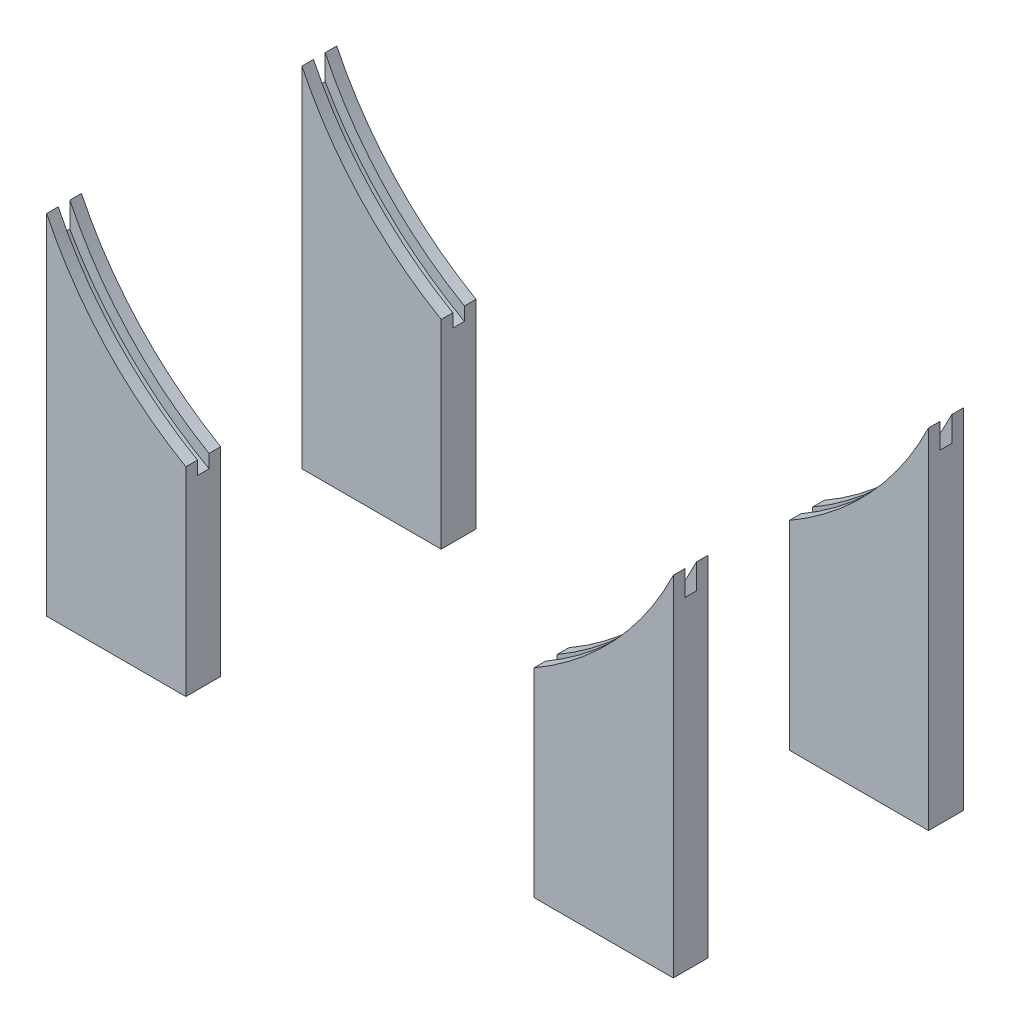
ISO-10303-21;
HEADER;
FILE_DESCRIPTION(('STEP AP214'),'2;1');
FILE_NAME('part.step','',(''),(''),'','','');
FILE_SCHEMA(('AUTOMOTIVE_DESIGN { 1 0 10303 214 1 1 1 1 }'));
ENDSEC;
DATA;
#1=APPLICATION_CONTEXT('core data for automotive mechanical design processes');
#2=APPLICATION_PROTOCOL_DEFINITION('international standard','automotive_design',2000,#1);
#3=PRODUCT_CONTEXT('',#1,'mechanical');
#4=PRODUCT('Part','Part','',(#3));
#5=PRODUCT_RELATED_PRODUCT_CATEGORY('part','',(#4));
#6=PRODUCT_DEFINITION_FORMATION('','',#4);
#7=PRODUCT_DEFINITION_CONTEXT('part definition',#1,'design');
#8=PRODUCT_DEFINITION('design','',#6,#7);
#9=PRODUCT_DEFINITION_SHAPE('','',#8);
#10=(LENGTH_UNIT() NAMED_UNIT(*) SI_UNIT(.MILLI.,.METRE.));
#11=(NAMED_UNIT(*) PLANE_ANGLE_UNIT() SI_UNIT($,.RADIAN.));
#12=(NAMED_UNIT(*) SI_UNIT($,.STERADIAN.) SOLID_ANGLE_UNIT());
#13=UNCERTAINTY_MEASURE_WITH_UNIT(LENGTH_MEASURE(1.E-05),#10,'distance_accuracy_value','');
#14=(GEOMETRIC_REPRESENTATION_CONTEXT(3) GLOBAL_UNCERTAINTY_ASSIGNED_CONTEXT((#13)) GLOBAL_UNIT_ASSIGNED_CONTEXT((#10,
#11,#12)) REPRESENTATION_CONTEXT('',''));
#15=CARTESIAN_POINT('',(0.,0.,0.));
#16=DIRECTION('',(0.,0.,1.));
#17=DIRECTION('',(1.,0.,0.));
#18=AXIS2_PLACEMENT_3D('',#15,#16,#17);
#19=CARTESIAN_POINT('',(0.,0.,110.));
#20=DIRECTION('',(0.,0.,1.));
#21=DIRECTION('',(1.,0.,0.));
#22=AXIS2_PLACEMENT_3D('',#19,#20,#21);
#23=CYLINDRICAL_SURFACE('',#22,155.);
#24=CARTESIAN_POINT('',(0.,0.,115.));
#25=DIRECTION('',(0.,0.,1.));
#26=DIRECTION('',(-1.,0.,0.));
#27=AXIS2_PLACEMENT_3D('',#24,#25,#26);
#28=CIRCLE('',#27,155.);
#29=CARTESIAN_POINT('',(-135.,-76.157731058639,115.));
#30=VERTEX_POINT('',#29);
#31=CARTESIAN_POINT('',(-75.,-135.646599662505,115.));
#32=VERTEX_POINT('',#31);
#33=EDGE_CURVE('E157',#30,#32,#28,.T.);
#34=ORIENTED_EDGE('',*,*,#33,.T.);
#35=DIRECTION('',(0.,0.,1.));
#36=VECTOR('',#35,1.);
#37=CARTESIAN_POINT('',(-75.,-135.646599662505,110.));
#38=LINE('',#37,#36);
#39=CARTESIAN_POINT('',(-74.9999999999997,-135.646599662506,110.));
#40=VERTEX_POINT('',#39);
#41=EDGE_CURVE('E12',#40,#32,#38,.T.);
#42=ORIENTED_EDGE('',*,*,#41,.F.);
#43=CARTESIAN_POINT('',(0.,0.,110.));
#44=DIRECTION('',(0.,0.,1.));
#45=DIRECTION('',(-1.,0.,0.));
#46=AXIS2_PLACEMENT_3D('',#43,#44,#45);
#47=CIRCLE('',#46,155.);
#48=CARTESIAN_POINT('',(-135.,-76.1577310586391,110.));
#49=VERTEX_POINT('',#48);
#50=EDGE_CURVE('E158',#49,#40,#47,.T.);
#51=ORIENTED_EDGE('',*,*,#50,.F.);
#52=DIRECTION('',(0.,0.,1.));
#53=VECTOR('',#52,1.);
#54=CARTESIAN_POINT('',(-135.,-76.1577310586391,110.));
#55=LINE('',#54,#53);
#56=EDGE_CURVE('E160',#49,#30,#55,.T.);
#57=ORIENTED_EDGE('',*,*,#56,.T.);
#58=EDGE_LOOP('',(#34,#42,#51,#57));
#59=FACE_BOUND('',#58,.T.);
#60=ADVANCED_FACE('F46',(#59),#23,.F.);
#61=CARTESIAN_POINT('',(-75.,-135.646599662505,110.));
#62=DIRECTION('',(-1.,0.,0.));
#63=DIRECTION('',(0.,1.,0.));
#64=AXIS2_PLACEMENT_3D('',#61,#62,#63);
#65=PLANE('',#64);
#66=ORIENTED_EDGE('',*,*,#41,.T.);
#67=DIRECTION('',(0.,-1.,0.));
#68=VECTOR('',#67,1.);
#69=CARTESIAN_POINT('',(-74.9999999999996,-129.903810567666,115.));
#70=LINE('',#69,#68);
#71=CARTESIAN_POINT('',(-74.9999999999996,-129.903810567666,115.));
#72=VERTEX_POINT('',#71);
#73=EDGE_CURVE('E130',#72,#32,#70,.T.);
#74=ORIENTED_EDGE('',*,*,#73,.F.);
#75=DIRECTION('',(0.,0.,-1.));
#76=VECTOR('',#75,1.);
#77=CARTESIAN_POINT('',(-74.9999999999996,-129.903810567666,120.));
#78=LINE('',#77,#76);
#79=CARTESIAN_POINT('',(-74.9999999999996,-129.903810567666,120.));
#80=VERTEX_POINT('',#79);
#81=EDGE_CURVE('E111',#80,#72,#78,.T.);
#82=ORIENTED_EDGE('',*,*,#81,.F.);
#83=DIRECTION('',(0.,-1.,0.));
#84=VECTOR('',#83,1.);
#85=CARTESIAN_POINT('',(-74.9999999999996,-129.903810567666,120.));
#86=LINE('',#85,#84);
#87=CARTESIAN_POINT('',(-75.,-215.646599662505,120.));
#88=VERTEX_POINT('',#87);
#89=EDGE_CURVE('E118',#80,#88,#86,.T.);
#90=ORIENTED_EDGE('',*,*,#89,.T.);
#91=DIRECTION('',(0.,0.,1.));
#92=VECTOR('',#91,1.);
#93=CARTESIAN_POINT('',(-75.,-215.646599662505,110.));
#94=LINE('',#93,#92);
#95=CARTESIAN_POINT('',(-75.,-215.646599662505,105.));
#96=VERTEX_POINT('',#95);
#97=EDGE_CURVE('E54',#96,#88,#94,.T.);
#98=ORIENTED_EDGE('',*,*,#97,.F.);
#99=DIRECTION('',(0.,-1.,0.));
#100=VECTOR('',#99,1.);
#101=CARTESIAN_POINT('',(-74.9999999999996,-129.903810567666,105.));
#102=LINE('',#101,#100);
#103=CARTESIAN_POINT('',(-74.9999999999996,-129.903810567666,105.));
#104=VERTEX_POINT('',#103);
#105=EDGE_CURVE('E137',#104,#96,#102,.T.);
#106=ORIENTED_EDGE('',*,*,#105,.F.);
#107=DIRECTION('',(0.,0.,1.));
#108=VECTOR('',#107,1.);
#109=CARTESIAN_POINT('',(-74.9999999999996,-129.903810567666,105.));
#110=LINE('',#109,#108);
#111=CARTESIAN_POINT('',(-74.9999999999996,-129.903810567666,110.));
#112=VERTEX_POINT('',#111);
#113=EDGE_CURVE('E148',#104,#112,#110,.T.);
#114=ORIENTED_EDGE('',*,*,#113,.T.);
#115=DIRECTION('',(0.,-1.,0.));
#116=VECTOR('',#115,1.);
#117=CARTESIAN_POINT('',(-74.9999999999996,-129.903810567666,110.));
#118=LINE('',#117,#116);
#119=EDGE_CURVE('E131',#112,#40,#118,.T.);
#120=ORIENTED_EDGE('',*,*,#119,.T.);
#121=EDGE_LOOP('',(#66,#74,#82,#90,#98,#106,#114,#120));
#122=FACE_BOUND('',#121,.T.);
#123=ADVANCED_FACE('F129',(#122),#65,.F.);
#124=CARTESIAN_POINT('',(-75.,-215.646599662505,110.));
#125=DIRECTION('',(0.,1.,0.));
#126=DIRECTION('',(0.,0.,-1.));
#127=AXIS2_PLACEMENT_3D('',#124,#125,#126);
#128=PLANE('',#127);
#129=ORIENTED_EDGE('',*,*,#97,.T.);
#130=DIRECTION('',(-1.,0.,0.));
#131=VECTOR('',#130,1.);
#132=CARTESIAN_POINT('',(-75.,-215.646599662505,120.));
#133=LINE('',#132,#131);
#134=CARTESIAN_POINT('',(-135.,-215.646599662505,120.));
#135=VERTEX_POINT('',#134);
#136=EDGE_CURVE('E123',#88,#135,#133,.T.);
#137=ORIENTED_EDGE('',*,*,#136,.T.);
#138=DIRECTION('',(0.,0.,1.));
#139=VECTOR('',#138,1.);
#140=CARTESIAN_POINT('',(-135.,-215.646599662505,110.));
#141=LINE('',#140,#139);
#142=CARTESIAN_POINT('',(-135.,-215.646599662505,105.));
#143=VERTEX_POINT('',#142);
#144=EDGE_CURVE('E165',#143,#135,#141,.T.);
#145=ORIENTED_EDGE('',*,*,#144,.F.);
#146=DIRECTION('',(-1.,0.,0.));
#147=VECTOR('',#146,1.);
#148=CARTESIAN_POINT('',(-75.,-215.646599662505,105.));
#149=LINE('',#148,#147);
#150=EDGE_CURVE('E140',#96,#143,#149,.T.);
#151=ORIENTED_EDGE('',*,*,#150,.F.);
#152=EDGE_LOOP('',(#129,#137,#145,#151));
#153=FACE_BOUND('',#152,.T.);
#154=ADVANCED_FACE('F168',(#153),#128,.F.);
#155=CARTESIAN_POINT('',(-135.,-215.646599662505,110.));
#156=DIRECTION('',(1.,0.,0.));
#157=DIRECTION('',(0.,-1.,0.));
#158=AXIS2_PLACEMENT_3D('',#155,#156,#157);
#159=PLANE('',#158);
#160=ORIENTED_EDGE('',*,*,#144,.T.);
#161=DIRECTION('',(0.,1.,0.));
#162=VECTOR('',#161,1.);
#163=CARTESIAN_POINT('',(-135.,-215.646599662505,120.));
#164=LINE('',#163,#162);
#165=CARTESIAN_POINT('',(-135.,-65.38348415311,120.));
#166=VERTEX_POINT('',#165);
#167=EDGE_CURVE('E117',#135,#166,#164,.T.);
#168=ORIENTED_EDGE('',*,*,#167,.T.);
#169=DIRECTION('',(0.,0.,-1.));
#170=VECTOR('',#169,1.);
#171=CARTESIAN_POINT('',(-135.,-65.38348415311,120.));
#172=LINE('',#171,#170);
#173=CARTESIAN_POINT('',(-135.,-65.38348415311,115.));
#174=VERTEX_POINT('',#173);
#175=EDGE_CURVE('E114',#166,#174,#172,.T.);
#176=ORIENTED_EDGE('',*,*,#175,.T.);
#177=DIRECTION('',(0.,1.,0.));
#178=VECTOR('',#177,1.);
#179=CARTESIAN_POINT('',(-135.,-215.646599662505,115.));
#180=LINE('',#179,#178);
#181=EDGE_CURVE('E127',#30,#174,#180,.T.);
#182=ORIENTED_EDGE('',*,*,#181,.F.);
#183=ORIENTED_EDGE('',*,*,#56,.F.);
#184=DIRECTION('',(0.,1.,0.));
#185=VECTOR('',#184,1.);
#186=CARTESIAN_POINT('',(-135.,-215.646599662505,110.));
#187=LINE('',#186,#185);
#188=CARTESIAN_POINT('',(-135.,-65.38348415311,110.));
#189=VERTEX_POINT('',#188);
#190=EDGE_CURVE('E60',#49,#189,#187,.T.);
#191=ORIENTED_EDGE('',*,*,#190,.T.);
#192=DIRECTION('',(0.,0.,1.));
#193=VECTOR('',#192,1.);
#194=CARTESIAN_POINT('',(-135.,-65.38348415311,105.));
#195=LINE('',#194,#193);
#196=CARTESIAN_POINT('',(-135.,-65.38348415311,105.));
#197=VERTEX_POINT('',#196);
#198=EDGE_CURVE('E154',#197,#189,#195,.T.);
#199=ORIENTED_EDGE('',*,*,#198,.F.);
#200=DIRECTION('',(0.,1.,0.));
#201=VECTOR('',#200,1.);
#202=CARTESIAN_POINT('',(-135.,-215.646599662505,105.));
#203=LINE('',#202,#201);
#204=EDGE_CURVE('E144',#143,#197,#203,.T.);
#205=ORIENTED_EDGE('',*,*,#204,.F.);
#206=EDGE_LOOP('',(#160,#168,#176,#182,#183,#191,#199,#205));
#207=FACE_BOUND('',#206,.T.);
#208=ADVANCED_FACE('F192',(#207),#159,.F.);
#209=CARTESIAN_POINT('',(2.67841304690819E-11,2.49383846906426E-11,110.));
#210=DIRECTION('',(0.,0.,1.));
#211=DIRECTION('',(1.,0.,0.));
#212=AXIS2_PLACEMENT_3D('',#209,#210,#211);
#213=PLANE('',#212);
#214=ORIENTED_EDGE('',*,*,#190,.F.);
#215=ORIENTED_EDGE('',*,*,#50,.T.);
#216=ORIENTED_EDGE('',*,*,#119,.F.);
#217=CARTESIAN_POINT('',(2.67841304690819E-11,2.49383846906426E-11,110.));
#218=DIRECTION('',(0.,0.,1.));
#219=DIRECTION('',(1.,0.,0.));
#220=AXIS2_PLACEMENT_3D('',#217,#218,#219);
#221=CIRCLE('',#220,150.000000000035);
#222=EDGE_CURVE('E141',#189,#112,#221,.T.);
#223=ORIENTED_EDGE('',*,*,#222,.F.);
#224=EDGE_LOOP('',(#214,#215,#216,#223));
#225=FACE_BOUND('',#224,.T.);
#226=ADVANCED_FACE('F178',(#225),#213,.T.);
#227=CARTESIAN_POINT('',(2.67841304690819E-11,2.49383846906426E-11,105.));
#228=DIRECTION('',(0.,0.,1.));
#229=DIRECTION('',(1.,0.,0.));
#230=AXIS2_PLACEMENT_3D('',#227,#228,#229);
#231=CYLINDRICAL_SURFACE('',#230,150.000000000035);
#232=ORIENTED_EDGE('',*,*,#222,.T.);
#233=ORIENTED_EDGE('',*,*,#113,.F.);
#234=CARTESIAN_POINT('',(2.67841304690819E-11,2.49383846906426E-11,105.));
#235=DIRECTION('',(0.,0.,1.));
#236=DIRECTION('',(1.,0.,0.));
#237=AXIS2_PLACEMENT_3D('',#234,#235,#236);
#238=CIRCLE('',#237,150.000000000035);
#239=EDGE_CURVE('E147',#197,#104,#238,.T.);
#240=ORIENTED_EDGE('',*,*,#239,.F.);
#241=ORIENTED_EDGE('',*,*,#198,.T.);
#242=EDGE_LOOP('',(#232,#233,#240,#241));
#243=FACE_BOUND('',#242,.T.);
#244=ADVANCED_FACE('F176',(#243),#231,.F.);
#245=CARTESIAN_POINT('',(2.67841304690819E-11,2.49383846906426E-11,105.));
#246=DIRECTION('',(0.,0.,1.));
#247=DIRECTION('',(1.,0.,0.));
#248=AXIS2_PLACEMENT_3D('',#245,#246,#247);
#249=PLANE('',#248);
#250=ORIENTED_EDGE('',*,*,#105,.T.);
#251=ORIENTED_EDGE('',*,*,#150,.T.);
#252=ORIENTED_EDGE('',*,*,#204,.T.);
#253=ORIENTED_EDGE('',*,*,#239,.T.);
#254=EDGE_LOOP('',(#250,#251,#252,#253));
#255=FACE_BOUND('',#254,.T.);
#256=ADVANCED_FACE('F173',(#255),#249,.F.);
#257=CARTESIAN_POINT('',(2.67841304690819E-11,2.49383846906426E-11,115.));
#258=DIRECTION('',(0.,0.,-1.));
#259=DIRECTION('',(1.,0.,0.));
#260=AXIS2_PLACEMENT_3D('',#257,#258,#259);
#261=PLANE('',#260);
#262=ORIENTED_EDGE('',*,*,#33,.F.);
#263=ORIENTED_EDGE('',*,*,#181,.T.);
#264=CARTESIAN_POINT('',(2.67841304690819E-11,2.49383846906426E-11,115.));
#265=DIRECTION('',(0.,0.,1.));
#266=DIRECTION('',(1.,0.,0.));
#267=AXIS2_PLACEMENT_3D('',#264,#265,#266);
#268=CIRCLE('',#267,150.000000000035);
#269=EDGE_CURVE('E186',#174,#72,#268,.T.);
#270=ORIENTED_EDGE('',*,*,#269,.T.);
#271=ORIENTED_EDGE('',*,*,#73,.T.);
#272=EDGE_LOOP('',(#262,#263,#270,#271));
#273=FACE_BOUND('',#272,.T.);
#274=ADVANCED_FACE('F185',(#273),#261,.T.);
#275=CARTESIAN_POINT('',(2.67841304690819E-11,2.49383846906426E-11,120.));
#276=DIRECTION('',(0.,0.,-1.));
#277=DIRECTION('',(-1.,0.,0.));
#278=AXIS2_PLACEMENT_3D('',#275,#276,#277);
#279=CYLINDRICAL_SURFACE('',#278,150.000000000035);
#280=ORIENTED_EDGE('',*,*,#269,.F.);
#281=ORIENTED_EDGE('',*,*,#175,.F.);
#282=CARTESIAN_POINT('',(2.67841304690819E-11,2.49383846906426E-11,120.));
#283=DIRECTION('',(0.,0.,1.));
#284=DIRECTION('',(1.,0.,0.));
#285=AXIS2_PLACEMENT_3D('',#282,#283,#284);
#286=CIRCLE('',#285,150.000000000035);
#287=EDGE_CURVE('E107',#166,#80,#286,.T.);
#288=ORIENTED_EDGE('',*,*,#287,.T.);
#289=ORIENTED_EDGE('',*,*,#81,.T.);
#290=EDGE_LOOP('',(#280,#281,#288,#289));
#291=FACE_BOUND('',#290,.T.);
#292=ADVANCED_FACE('F109',(#291),#279,.F.);
#293=CARTESIAN_POINT('',(2.67841304690819E-11,2.49383846906426E-11,120.));
#294=DIRECTION('',(0.,0.,-1.));
#295=DIRECTION('',(1.,0.,0.));
#296=AXIS2_PLACEMENT_3D('',#293,#294,#295);
#297=PLANE('',#296);
#298=ORIENTED_EDGE('',*,*,#89,.F.);
#299=ORIENTED_EDGE('',*,*,#287,.F.);
#300=ORIENTED_EDGE('',*,*,#167,.F.);
#301=ORIENTED_EDGE('',*,*,#136,.F.);
#302=EDGE_LOOP('',(#298,#299,#300,#301));
#303=FACE_BOUND('',#302,.T.);
#304=ADVANCED_FACE('F121',(#303),#297,.F.);
#305=CLOSED_SHELL('',(#60,#123,#154,#208,#226,#244,#256,#274,#292,#304));
#306=MANIFOLD_SOLID_BREP('B2',#305);
#307=CARTESIAN_POINT('',(0.,0.,110.));
#308=DIRECTION('',(0.,0.,1.));
#309=DIRECTION('',(-1.,0.,0.));
#310=AXIS2_PLACEMENT_3D('',#307,#308,#309);
#311=CYLINDRICAL_SURFACE('',#310,155.);
#312=CARTESIAN_POINT('',(0.,0.,115.));
#313=DIRECTION('',(0.,0.,-1.));
#314=DIRECTION('',(1.,0.,0.));
#315=AXIS2_PLACEMENT_3D('',#312,#313,#314);
#316=CIRCLE('',#315,155.);
#317=CARTESIAN_POINT('',(135.,-76.157731058639,115.));
#318=VERTEX_POINT('',#317);
#319=CARTESIAN_POINT('',(75.,-135.646599662505,115.));
#320=VERTEX_POINT('',#319);
#321=EDGE_CURVE('E420',#318,#320,#316,.T.);
#322=ORIENTED_EDGE('',*,*,#321,.F.);
#323=DIRECTION('',(0.,0.,1.));
#324=VECTOR('',#323,1.);
#325=CARTESIAN_POINT('',(135.,-76.1577310586391,110.));
#326=LINE('',#325,#324);
#327=CARTESIAN_POINT('',(135.,-76.1577310586391,110.));
#328=VERTEX_POINT('',#327);
#329=EDGE_CURVE('E424',#328,#318,#326,.T.);
#330=ORIENTED_EDGE('',*,*,#329,.F.);
#331=CARTESIAN_POINT('',(0.,0.,110.));
#332=DIRECTION('',(0.,0.,-1.));
#333=DIRECTION('',(1.,0.,0.));
#334=AXIS2_PLACEMENT_3D('',#331,#332,#333);
#335=CIRCLE('',#334,155.);
#336=CARTESIAN_POINT('',(74.9999999999997,-135.646599662506,110.));
#337=VERTEX_POINT('',#336);
#338=EDGE_CURVE('E421',#328,#337,#335,.T.);
#339=ORIENTED_EDGE('',*,*,#338,.T.);
#340=DIRECTION('',(0.,0.,1.));
#341=VECTOR('',#340,1.);
#342=CARTESIAN_POINT('',(75.,-135.646599662505,110.));
#343=LINE('',#342,#341);
#344=EDGE_CURVE('E44',#337,#320,#343,.T.);
#345=ORIENTED_EDGE('',*,*,#344,.T.);
#346=EDGE_LOOP('',(#322,#330,#339,#345));
#347=FACE_BOUND('',#346,.T.);
#348=ADVANCED_FACE('F302',(#347),#311,.F.);
#349=CARTESIAN_POINT('',(75.,-135.646599662505,110.));
#350=DIRECTION('',(1.,0.,0.));
#351=DIRECTION('',(0.,1.,0.));
#352=AXIS2_PLACEMENT_3D('',#349,#350,#351);
#353=PLANE('',#352);
#354=ORIENTED_EDGE('',*,*,#344,.F.);
#355=DIRECTION('',(0.,-1.,0.));
#356=VECTOR('',#355,1.);
#357=CARTESIAN_POINT('',(74.9999999999996,-129.903810567666,110.));
#358=LINE('',#357,#356);
#359=CARTESIAN_POINT('',(74.9999999999996,-129.903810567666,110.));
#360=VERTEX_POINT('',#359);
#361=EDGE_CURVE('E382',#360,#337,#358,.T.);
#362=ORIENTED_EDGE('',*,*,#361,.F.);
#363=DIRECTION('',(0.,0.,1.));
#364=VECTOR('',#363,1.);
#365=CARTESIAN_POINT('',(74.9999999999996,-129.903810567666,105.));
#366=LINE('',#365,#364);
#367=CARTESIAN_POINT('',(74.9999999999996,-129.903810567666,105.));
#368=VERTEX_POINT('',#367);
#369=EDGE_CURVE('E412',#368,#360,#366,.T.);
#370=ORIENTED_EDGE('',*,*,#369,.F.);
#371=DIRECTION('',(0.,-1.,0.));
#372=VECTOR('',#371,1.);
#373=CARTESIAN_POINT('',(74.9999999999996,-129.903810567666,105.));
#374=LINE('',#373,#372);
#375=CARTESIAN_POINT('',(75.,-215.646599662505,105.));
#376=VERTEX_POINT('',#375);
#377=EDGE_CURVE('E401',#368,#376,#374,.T.);
#378=ORIENTED_EDGE('',*,*,#377,.T.);
#379=DIRECTION('',(0.,0.,1.));
#380=VECTOR('',#379,1.);
#381=CARTESIAN_POINT('',(75.,-215.646599662505,110.));
#382=LINE('',#381,#380);
#383=CARTESIAN_POINT('',(75.,-215.646599662505,120.));
#384=VERTEX_POINT('',#383);
#385=EDGE_CURVE('E310',#376,#384,#382,.T.);
#386=ORIENTED_EDGE('',*,*,#385,.T.);
#387=DIRECTION('',(0.,-1.,0.));
#388=VECTOR('',#387,1.);
#389=CARTESIAN_POINT('',(74.9999999999996,-129.903810567666,120.));
#390=LINE('',#389,#388);
#391=CARTESIAN_POINT('',(74.9999999999996,-129.903810567666,120.));
#392=VERTEX_POINT('',#391);
#393=EDGE_CURVE('E369',#392,#384,#390,.T.);
#394=ORIENTED_EDGE('',*,*,#393,.F.);
#395=DIRECTION('',(0.,0.,-1.));
#396=VECTOR('',#395,1.);
#397=CARTESIAN_POINT('',(74.9999999999996,-129.903810567666,120.));
#398=LINE('',#397,#396);
#399=CARTESIAN_POINT('',(74.9999999999996,-129.903810567666,115.));
#400=VERTEX_POINT('',#399);
#401=EDGE_CURVE('E377',#392,#400,#398,.T.);
#402=ORIENTED_EDGE('',*,*,#401,.T.);
#403=DIRECTION('',(0.,-1.,0.));
#404=VECTOR('',#403,1.);
#405=CARTESIAN_POINT('',(74.9999999999996,-129.903810567666,115.));
#406=LINE('',#405,#404);
#407=EDGE_CURVE('E397',#400,#320,#406,.T.);
#408=ORIENTED_EDGE('',*,*,#407,.T.);
#409=EDGE_LOOP('',(#354,#362,#370,#378,#386,#394,#402,#408));
#410=FACE_BOUND('',#409,.T.);
#411=ADVANCED_FACE('F386',(#410),#353,.F.);
#412=CARTESIAN_POINT('',(75.,-215.646599662505,110.));
#413=DIRECTION('',(0.,1.,0.));
#414=DIRECTION('',(0.,0.,-1.));
#415=AXIS2_PLACEMENT_3D('',#412,#413,#414);
#416=PLANE('',#415);
#417=ORIENTED_EDGE('',*,*,#385,.F.);
#418=DIRECTION('',(1.,0.,0.));
#419=VECTOR('',#418,1.);
#420=CARTESIAN_POINT('',(75.,-215.646599662505,105.));
#421=LINE('',#420,#419);
#422=CARTESIAN_POINT('',(135.,-215.646599662505,105.));
#423=VERTEX_POINT('',#422);
#424=EDGE_CURVE('E403',#376,#423,#421,.T.);
#425=ORIENTED_EDGE('',*,*,#424,.T.);
#426=DIRECTION('',(0.,0.,1.));
#427=VECTOR('',#426,1.);
#428=CARTESIAN_POINT('',(135.,-215.646599662505,110.));
#429=LINE('',#428,#427);
#430=CARTESIAN_POINT('',(135.,-215.646599662505,120.));
#431=VERTEX_POINT('',#430);
#432=EDGE_CURVE('E428',#423,#431,#429,.T.);
#433=ORIENTED_EDGE('',*,*,#432,.T.);
#434=DIRECTION('',(1.,0.,0.));
#435=VECTOR('',#434,1.);
#436=CARTESIAN_POINT('',(75.,-215.646599662505,120.));
#437=LINE('',#436,#435);
#438=EDGE_CURVE('E395',#384,#431,#437,.T.);
#439=ORIENTED_EDGE('',*,*,#438,.F.);
#440=EDGE_LOOP('',(#417,#425,#433,#439));
#441=FACE_BOUND('',#440,.T.);
#442=ADVANCED_FACE('F432',(#441),#416,.F.);
#443=CARTESIAN_POINT('',(135.,-215.646599662505,110.));
#444=DIRECTION('',(-1.,0.,0.));
#445=DIRECTION('',(0.,-1.,0.));
#446=AXIS2_PLACEMENT_3D('',#443,#444,#445);
#447=PLANE('',#446);
#448=ORIENTED_EDGE('',*,*,#432,.F.);
#449=DIRECTION('',(0.,1.,0.));
#450=VECTOR('',#449,1.);
#451=CARTESIAN_POINT('',(135.,-215.646599662505,105.));
#452=LINE('',#451,#450);
#453=CARTESIAN_POINT('',(135.,-65.38348415311,105.));
#454=VERTEX_POINT('',#453);
#455=EDGE_CURVE('E407',#423,#454,#452,.T.);
#456=ORIENTED_EDGE('',*,*,#455,.T.);
#457=DIRECTION('',(0.,0.,1.));
#458=VECTOR('',#457,1.);
#459=CARTESIAN_POINT('',(135.,-65.38348415311,105.));
#460=LINE('',#459,#458);
#461=CARTESIAN_POINT('',(135.,-65.38348415311,110.));
#462=VERTEX_POINT('',#461);
#463=EDGE_CURVE('E418',#454,#462,#460,.T.);
#464=ORIENTED_EDGE('',*,*,#463,.T.);
#465=DIRECTION('',(0.,1.,0.));
#466=VECTOR('',#465,1.);
#467=CARTESIAN_POINT('',(135.,-215.646599662505,110.));
#468=LINE('',#467,#466);
#469=EDGE_CURVE('E316',#328,#462,#468,.T.);
#470=ORIENTED_EDGE('',*,*,#469,.F.);
#471=ORIENTED_EDGE('',*,*,#329,.T.);
#472=DIRECTION('',(0.,1.,0.));
#473=VECTOR('',#472,1.);
#474=CARTESIAN_POINT('',(135.,-215.646599662505,115.));
#475=LINE('',#474,#473);
#476=CARTESIAN_POINT('',(135.,-65.38348415311,115.));
#477=VERTEX_POINT('',#476);
#478=EDGE_CURVE('E389',#318,#477,#475,.T.);
#479=ORIENTED_EDGE('',*,*,#478,.T.);
#480=DIRECTION('',(0.,0.,-1.));
#481=VECTOR('',#480,1.);
#482=CARTESIAN_POINT('',(135.,-65.38348415311,120.));
#483=LINE('',#482,#481);
#484=CARTESIAN_POINT('',(135.,-65.38348415311,120.));
#485=VERTEX_POINT('',#484);
#486=EDGE_CURVE('E383',#485,#477,#483,.T.);
#487=ORIENTED_EDGE('',*,*,#486,.F.);
#488=DIRECTION('',(0.,1.,0.));
#489=VECTOR('',#488,1.);
#490=CARTESIAN_POINT('',(135.,-215.646599662505,120.));
#491=LINE('',#490,#489);
#492=EDGE_CURVE('E371',#431,#485,#491,.T.);
#493=ORIENTED_EDGE('',*,*,#492,.F.);
#494=EDGE_LOOP('',(#448,#456,#464,#470,#471,#479,#487,#493));
#495=FACE_BOUND('',#494,.T.);
#496=ADVANCED_FACE('F433',(#495),#447,.F.);
#497=CARTESIAN_POINT('',(-2.67841304690819E-11,2.49383846906426E-11,110.));
#498=DIRECTION('',(0.,0.,1.));
#499=DIRECTION('',(-1.,0.,0.));
#500=AXIS2_PLACEMENT_3D('',#497,#498,#499);
#501=PLANE('',#500);
#502=ORIENTED_EDGE('',*,*,#469,.T.);
#503=CARTESIAN_POINT('',(-2.67841304690819E-11,2.49383846906426E-11,110.));
#504=DIRECTION('',(0.,0.,-1.));
#505=DIRECTION('',(-1.,0.,0.));
#506=AXIS2_PLACEMENT_3D('',#503,#504,#505);
#507=CIRCLE('',#506,150.000000000035);
#508=EDGE_CURVE('E404',#462,#360,#507,.T.);
#509=ORIENTED_EDGE('',*,*,#508,.T.);
#510=ORIENTED_EDGE('',*,*,#361,.T.);
#511=ORIENTED_EDGE('',*,*,#338,.F.);
#512=EDGE_LOOP('',(#502,#509,#510,#511));
#513=FACE_BOUND('',#512,.T.);
#514=ADVANCED_FACE('F441',(#513),#501,.T.);
#515=CARTESIAN_POINT('',(-2.67841304690819E-11,2.49383846906426E-11,105.));
#516=DIRECTION('',(0.,0.,1.));
#517=DIRECTION('',(-1.,0.,0.));
#518=AXIS2_PLACEMENT_3D('',#515,#516,#517);
#519=CYLINDRICAL_SURFACE('',#518,150.000000000035);
#520=ORIENTED_EDGE('',*,*,#508,.F.);
#521=ORIENTED_EDGE('',*,*,#463,.F.);
#522=CARTESIAN_POINT('',(-2.67841304690819E-11,2.49383846906426E-11,105.));
#523=DIRECTION('',(0.,0.,-1.));
#524=DIRECTION('',(-1.,0.,0.));
#525=AXIS2_PLACEMENT_3D('',#522,#523,#524);
#526=CIRCLE('',#525,150.000000000035);
#527=EDGE_CURVE('E410',#454,#368,#526,.T.);
#528=ORIENTED_EDGE('',*,*,#527,.T.);
#529=ORIENTED_EDGE('',*,*,#369,.T.);
#530=EDGE_LOOP('',(#520,#521,#528,#529));
#531=FACE_BOUND('',#530,.T.);
#532=ADVANCED_FACE('F445',(#531),#519,.F.);
#533=CARTESIAN_POINT('',(-2.67841304690819E-11,2.49383846906426E-11,105.));
#534=DIRECTION('',(0.,0.,1.));
#535=DIRECTION('',(-1.,0.,0.));
#536=AXIS2_PLACEMENT_3D('',#533,#534,#535);
#537=PLANE('',#536);
#538=ORIENTED_EDGE('',*,*,#377,.F.);
#539=ORIENTED_EDGE('',*,*,#527,.F.);
#540=ORIENTED_EDGE('',*,*,#455,.F.);
#541=ORIENTED_EDGE('',*,*,#424,.F.);
#542=EDGE_LOOP('',(#538,#539,#540,#541));
#543=FACE_BOUND('',#542,.T.);
#544=ADVANCED_FACE('F448',(#543),#537,.F.);
#545=CARTESIAN_POINT('',(-2.67841304690819E-11,2.49383846906426E-11,115.));
#546=DIRECTION('',(0.,0.,-1.));
#547=DIRECTION('',(-1.,0.,0.));
#548=AXIS2_PLACEMENT_3D('',#545,#546,#547);
#549=PLANE('',#548);
#550=ORIENTED_EDGE('',*,*,#321,.T.);
#551=ORIENTED_EDGE('',*,*,#407,.F.);
#552=CARTESIAN_POINT('',(-2.67841304690819E-11,2.49383846906426E-11,115.));
#553=DIRECTION('',(0.,0.,-1.));
#554=DIRECTION('',(-1.,0.,0.));
#555=AXIS2_PLACEMENT_3D('',#552,#553,#554);
#556=CIRCLE('',#555,150.000000000035);
#557=EDGE_CURVE('E379',#477,#400,#556,.T.);
#558=ORIENTED_EDGE('',*,*,#557,.F.);
#559=ORIENTED_EDGE('',*,*,#478,.F.);
#560=EDGE_LOOP('',(#550,#551,#558,#559));
#561=FACE_BOUND('',#560,.T.);
#562=ADVANCED_FACE('F437',(#561),#549,.T.);
#563=CARTESIAN_POINT('',(-2.67841304690819E-11,2.49383846906426E-11,120.));
#564=DIRECTION('',(0.,0.,-1.));
#565=DIRECTION('',(1.,0.,0.));
#566=AXIS2_PLACEMENT_3D('',#563,#564,#565);
#567=CYLINDRICAL_SURFACE('',#566,150.000000000035);
#568=ORIENTED_EDGE('',*,*,#557,.T.);
#569=ORIENTED_EDGE('',*,*,#401,.F.);
#570=CARTESIAN_POINT('',(-2.67841304690819E-11,2.49383846906426E-11,120.));
#571=DIRECTION('',(0.,0.,-1.));
#572=DIRECTION('',(-1.,0.,0.));
#573=AXIS2_PLACEMENT_3D('',#570,#571,#572);
#574=CIRCLE('',#573,150.000000000035);
#575=EDGE_CURVE('E364',#485,#392,#574,.T.);
#576=ORIENTED_EDGE('',*,*,#575,.F.);
#577=ORIENTED_EDGE('',*,*,#486,.T.);
#578=EDGE_LOOP('',(#568,#569,#576,#577));
#579=FACE_BOUND('',#578,.T.);
#580=ADVANCED_FACE('F378',(#579),#567,.F.);
#581=CARTESIAN_POINT('',(-2.67841304690819E-11,2.49383846906426E-11,120.));
#582=DIRECTION('',(0.,0.,-1.));
#583=DIRECTION('',(-1.,0.,0.));
#584=AXIS2_PLACEMENT_3D('',#581,#582,#583);
#585=PLANE('',#584);
#586=ORIENTED_EDGE('',*,*,#393,.T.);
#587=ORIENTED_EDGE('',*,*,#438,.T.);
#588=ORIENTED_EDGE('',*,*,#492,.T.);
#589=ORIENTED_EDGE('',*,*,#575,.T.);
#590=EDGE_LOOP('',(#586,#587,#588,#589));
#591=FACE_BOUND('',#590,.T.);
#592=ADVANCED_FACE('F366',(#591),#585,.F.);
#593=CLOSED_SHELL('',(#348,#411,#442,#496,#514,#532,#544,#562,#580,#592));
#594=MANIFOLD_SOLID_BREP('B6',#593);
#595=CARTESIAN_POINT('',(0.,0.,5.));
#596=DIRECTION('',(0.,0.,-1.));
#597=DIRECTION('',(1.,0.,0.));
#598=AXIS2_PLACEMENT_3D('',#595,#596,#597);
#599=CYLINDRICAL_SURFACE('',#598,155.);
#600=CARTESIAN_POINT('',(0.,0.,0.));
#601=DIRECTION('',(0.,0.,1.));
#602=DIRECTION('',(-1.,0.,0.));
#603=AXIS2_PLACEMENT_3D('',#600,#601,#602);
#604=CIRCLE('',#603,155.);
#605=CARTESIAN_POINT('',(-135.,-76.157731058639,0.));
#606=VERTEX_POINT('',#605);
#607=CARTESIAN_POINT('',(-75.,-135.646599662505,0.));
#608=VERTEX_POINT('',#607);
#609=EDGE_CURVE('E675',#606,#608,#604,.T.);
#610=ORIENTED_EDGE('',*,*,#609,.F.);
#611=DIRECTION('',(0.,0.,-1.));
#612=VECTOR('',#611,1.);
#613=CARTESIAN_POINT('',(-135.,-76.1577310586391,5.));
#614=LINE('',#613,#612);
#615=CARTESIAN_POINT('',(-135.,-76.1577310586391,5.));
#616=VERTEX_POINT('',#615);
#617=EDGE_CURVE('E679',#616,#606,#614,.T.);
#618=ORIENTED_EDGE('',*,*,#617,.F.);
#619=CARTESIAN_POINT('',(0.,0.,5.));
#620=DIRECTION('',(0.,0.,1.));
#621=DIRECTION('',(-1.,0.,0.));
#622=AXIS2_PLACEMENT_3D('',#619,#620,#621);
#623=CIRCLE('',#622,155.);
#624=CARTESIAN_POINT('',(-74.9999999999997,-135.646599662506,5.));
#625=VERTEX_POINT('',#624);
#626=EDGE_CURVE('E676',#616,#625,#623,.T.);
#627=ORIENTED_EDGE('',*,*,#626,.T.);
#628=DIRECTION('',(0.,0.,-1.));
#629=VECTOR('',#628,1.);
#630=CARTESIAN_POINT('',(-75.,-135.646599662505,5.));
#631=LINE('',#630,#629);
#632=EDGE_CURVE('E300',#625,#608,#631,.T.);
#633=ORIENTED_EDGE('',*,*,#632,.T.);
#634=EDGE_LOOP('',(#610,#618,#627,#633));
#635=FACE_BOUND('',#634,.T.);
#636=ADVANCED_FACE('F557',(#635),#599,.F.);
#637=CARTESIAN_POINT('',(-75.,-135.646599662505,5.));
#638=DIRECTION('',(-1.,0.,0.));
#639=DIRECTION('',(0.,1.,0.));
#640=AXIS2_PLACEMENT_3D('',#637,#638,#639);
#641=PLANE('',#640);
#642=ORIENTED_EDGE('',*,*,#632,.F.);
#643=DIRECTION('',(0.,-1.,0.));
#644=VECTOR('',#643,1.);
#645=CARTESIAN_POINT('',(-74.9999999999996,-129.903810567666,5.));
#646=LINE('',#645,#644);
#647=CARTESIAN_POINT('',(-74.9999999999996,-129.903810567666,5.));
#648=VERTEX_POINT('',#647);
#649=EDGE_CURVE('E637',#648,#625,#646,.T.);
#650=ORIENTED_EDGE('',*,*,#649,.F.);
#651=DIRECTION('',(0.,0.,-1.));
#652=VECTOR('',#651,1.);
#653=CARTESIAN_POINT('',(-74.9999999999996,-129.903810567666,10.));
#654=LINE('',#653,#652);
#655=CARTESIAN_POINT('',(-74.9999999999996,-129.903810567666,10.));
#656=VERTEX_POINT('',#655);
#657=EDGE_CURVE('E667',#656,#648,#654,.T.);
#658=ORIENTED_EDGE('',*,*,#657,.F.);
#659=DIRECTION('',(0.,-1.,0.));
#660=VECTOR('',#659,1.);
#661=CARTESIAN_POINT('',(-74.9999999999996,-129.903810567666,10.));
#662=LINE('',#661,#660);
#663=CARTESIAN_POINT('',(-75.,-215.646599662505,10.));
#664=VERTEX_POINT('',#663);
#665=EDGE_CURVE('E656',#656,#664,#662,.T.);
#666=ORIENTED_EDGE('',*,*,#665,.T.);
#667=DIRECTION('',(0.,0.,-1.));
#668=VECTOR('',#667,1.);
#669=CARTESIAN_POINT('',(-75.,-215.646599662505,5.));
#670=LINE('',#669,#668);
#671=CARTESIAN_POINT('',(-75.,-215.646599662505,-5.));
#672=VERTEX_POINT('',#671);
#673=EDGE_CURVE('E565',#664,#672,#670,.T.);
#674=ORIENTED_EDGE('',*,*,#673,.T.);
#675=DIRECTION('',(0.,-1.,0.));
#676=VECTOR('',#675,1.);
#677=CARTESIAN_POINT('',(-74.9999999999996,-129.903810567666,-5.));
#678=LINE('',#677,#676);
#679=CARTESIAN_POINT('',(-74.9999999999996,-129.903810567666,-5.));
#680=VERTEX_POINT('',#679);
#681=EDGE_CURVE('E624',#680,#672,#678,.T.);
#682=ORIENTED_EDGE('',*,*,#681,.F.);
#683=DIRECTION('',(0.,0.,1.));
#684=VECTOR('',#683,1.);
#685=CARTESIAN_POINT('',(-74.9999999999996,-129.903810567666,-5.));
#686=LINE('',#685,#684);
#687=CARTESIAN_POINT('',(-74.9999999999996,-129.903810567666,0.));
#688=VERTEX_POINT('',#687);
#689=EDGE_CURVE('E632',#680,#688,#686,.T.);
#690=ORIENTED_EDGE('',*,*,#689,.T.);
#691=DIRECTION('',(0.,-1.,0.));
#692=VECTOR('',#691,1.);
#693=CARTESIAN_POINT('',(-74.9999999999996,-129.903810567666,0.));
#694=LINE('',#693,#692);
#695=EDGE_CURVE('E652',#688,#608,#694,.T.);
#696=ORIENTED_EDGE('',*,*,#695,.T.);
#697=EDGE_LOOP('',(#642,#650,#658,#666,#674,#682,#690,#696));
#698=FACE_BOUND('',#697,.T.);
#699=ADVANCED_FACE('F641',(#698),#641,.F.);
#700=CARTESIAN_POINT('',(-75.,-215.646599662505,5.));
#701=DIRECTION('',(0.,1.,0.));
#702=DIRECTION('',(0.,0.,1.));
#703=AXIS2_PLACEMENT_3D('',#700,#701,#702);
#704=PLANE('',#703);
#705=ORIENTED_EDGE('',*,*,#673,.F.);
#706=DIRECTION('',(-1.,0.,0.));
#707=VECTOR('',#706,1.);
#708=CARTESIAN_POINT('',(-75.,-215.646599662505,10.));
#709=LINE('',#708,#707);
#710=CARTESIAN_POINT('',(-135.,-215.646599662505,10.));
#711=VERTEX_POINT('',#710);
#712=EDGE_CURVE('E658',#664,#711,#709,.T.);
#713=ORIENTED_EDGE('',*,*,#712,.T.);
#714=DIRECTION('',(0.,0.,-1.));
#715=VECTOR('',#714,1.);
#716=CARTESIAN_POINT('',(-135.,-215.646599662505,5.));
#717=LINE('',#716,#715);
#718=CARTESIAN_POINT('',(-135.,-215.646599662505,-5.));
#719=VERTEX_POINT('',#718);
#720=EDGE_CURVE('E683',#711,#719,#717,.T.);
#721=ORIENTED_EDGE('',*,*,#720,.T.);
#722=DIRECTION('',(-1.,0.,0.));
#723=VECTOR('',#722,1.);
#724=CARTESIAN_POINT('',(-75.,-215.646599662505,-5.));
#725=LINE('',#724,#723);
#726=EDGE_CURVE('E650',#672,#719,#725,.T.);
#727=ORIENTED_EDGE('',*,*,#726,.F.);
#728=EDGE_LOOP('',(#705,#713,#721,#727));
#729=FACE_BOUND('',#728,.T.);
#730=ADVANCED_FACE('F687',(#729),#704,.F.);
#731=CARTESIAN_POINT('',(-135.,-215.646599662505,5.));
#732=DIRECTION('',(1.,0.,0.));
#733=DIRECTION('',(0.,-1.,0.));
#734=AXIS2_PLACEMENT_3D('',#731,#732,#733);
#735=PLANE('',#734);
#736=ORIENTED_EDGE('',*,*,#720,.F.);
#737=DIRECTION('',(0.,1.,0.));
#738=VECTOR('',#737,1.);
#739=CARTESIAN_POINT('',(-135.,-215.646599662505,10.));
#740=LINE('',#739,#738);
#741=CARTESIAN_POINT('',(-135.,-65.38348415311,10.));
#742=VERTEX_POINT('',#741);
#743=EDGE_CURVE('E662',#711,#742,#740,.T.);
#744=ORIENTED_EDGE('',*,*,#743,.T.);
#745=DIRECTION('',(0.,0.,-1.));
#746=VECTOR('',#745,1.);
#747=CARTESIAN_POINT('',(-135.,-65.38348415311,10.));
#748=LINE('',#747,#746);
#749=CARTESIAN_POINT('',(-135.,-65.38348415311,5.));
#750=VERTEX_POINT('',#749);
#751=EDGE_CURVE('E673',#742,#750,#748,.T.);
#752=ORIENTED_EDGE('',*,*,#751,.T.);
#753=DIRECTION('',(0.,1.,0.));
#754=VECTOR('',#753,1.);
#755=CARTESIAN_POINT('',(-135.,-215.646599662505,5.));
#756=LINE('',#755,#754);
#757=EDGE_CURVE('E571',#616,#750,#756,.T.);
#758=ORIENTED_EDGE('',*,*,#757,.F.);
#759=ORIENTED_EDGE('',*,*,#617,.T.);
#760=DIRECTION('',(0.,1.,0.));
#761=VECTOR('',#760,1.);
#762=CARTESIAN_POINT('',(-135.,-215.646599662505,0.));
#763=LINE('',#762,#761);
#764=CARTESIAN_POINT('',(-135.,-65.38348415311,0.));
#765=VERTEX_POINT('',#764);
#766=EDGE_CURVE('E644',#606,#765,#763,.T.);
#767=ORIENTED_EDGE('',*,*,#766,.T.);
#768=DIRECTION('',(0.,0.,1.));
#769=VECTOR('',#768,1.);
#770=CARTESIAN_POINT('',(-135.,-65.38348415311,-5.));
#771=LINE('',#770,#769);
#772=CARTESIAN_POINT('',(-135.,-65.38348415311,-5.));
#773=VERTEX_POINT('',#772);
#774=EDGE_CURVE('E638',#773,#765,#771,.T.);
#775=ORIENTED_EDGE('',*,*,#774,.F.);
#776=DIRECTION('',(0.,1.,0.));
#777=VECTOR('',#776,1.);
#778=CARTESIAN_POINT('',(-135.,-215.646599662505,-5.));
#779=LINE('',#778,#777);
#780=EDGE_CURVE('E626',#719,#773,#779,.T.);
#781=ORIENTED_EDGE('',*,*,#780,.F.);
#782=EDGE_LOOP('',(#736,#744,#752,#758,#759,#767,#775,#781));
#783=FACE_BOUND('',#782,.T.);
#784=ADVANCED_FACE('F688',(#783),#735,.F.);
#785=CARTESIAN_POINT('',(2.67841304690819E-11,2.49383846906426E-11,5.));
#786=DIRECTION('',(0.,0.,-1.));
#787=DIRECTION('',(1.,0.,0.));
#788=AXIS2_PLACEMENT_3D('',#785,#786,#787);
#789=PLANE('',#788);
#790=ORIENTED_EDGE('',*,*,#757,.T.);
#791=CARTESIAN_POINT('',(2.67841304690819E-11,2.49383846906426E-11,5.));
#792=DIRECTION('',(0.,0.,1.));
#793=DIRECTION('',(1.,0.,0.));
#794=AXIS2_PLACEMENT_3D('',#791,#792,#793);
#795=CIRCLE('',#794,150.000000000035);
#796=EDGE_CURVE('E659',#750,#648,#795,.T.);
#797=ORIENTED_EDGE('',*,*,#796,.T.);
#798=ORIENTED_EDGE('',*,*,#649,.T.);
#799=ORIENTED_EDGE('',*,*,#626,.F.);
#800=EDGE_LOOP('',(#790,#797,#798,#799));
#801=FACE_BOUND('',#800,.T.);
#802=ADVANCED_FACE('F696',(#801),#789,.T.);
#803=CARTESIAN_POINT('',(2.67841304690819E-11,2.49383846906426E-11,10.));
#804=DIRECTION('',(0.,0.,-1.));
#805=DIRECTION('',(1.,0.,0.));
#806=AXIS2_PLACEMENT_3D('',#803,#804,#805);
#807=CYLINDRICAL_SURFACE('',#806,150.000000000035);
#808=ORIENTED_EDGE('',*,*,#796,.F.);
#809=ORIENTED_EDGE('',*,*,#751,.F.);
#810=CARTESIAN_POINT('',(2.67841304690819E-11,2.49383846906426E-11,10.));
#811=DIRECTION('',(0.,0.,1.));
#812=DIRECTION('',(1.,0.,0.));
#813=AXIS2_PLACEMENT_3D('',#810,#811,#812);
#814=CIRCLE('',#813,150.000000000035);
#815=EDGE_CURVE('E665',#742,#656,#814,.T.);
#816=ORIENTED_EDGE('',*,*,#815,.T.);
#817=ORIENTED_EDGE('',*,*,#657,.T.);
#818=EDGE_LOOP('',(#808,#809,#816,#817));
#819=FACE_BOUND('',#818,.T.);
#820=ADVANCED_FACE('F700',(#819),#807,.F.);
#821=CARTESIAN_POINT('',(2.67841304690819E-11,2.49383846906426E-11,10.));
#822=DIRECTION('',(0.,0.,-1.));
#823=DIRECTION('',(1.,0.,0.));
#824=AXIS2_PLACEMENT_3D('',#821,#822,#823);
#825=PLANE('',#824);
#826=ORIENTED_EDGE('',*,*,#665,.F.);
#827=ORIENTED_EDGE('',*,*,#815,.F.);
#828=ORIENTED_EDGE('',*,*,#743,.F.);
#829=ORIENTED_EDGE('',*,*,#712,.F.);
#830=EDGE_LOOP('',(#826,#827,#828,#829));
#831=FACE_BOUND('',#830,.T.);
#832=ADVANCED_FACE('F703',(#831),#825,.F.);
#833=CARTESIAN_POINT('',(2.67841304690819E-11,2.49383846906426E-11,0.));
#834=DIRECTION('',(0.,0.,1.));
#835=DIRECTION('',(1.,0.,0.));
#836=AXIS2_PLACEMENT_3D('',#833,#834,#835);
#837=PLANE('',#836);
#838=ORIENTED_EDGE('',*,*,#609,.T.);
#839=ORIENTED_EDGE('',*,*,#695,.F.);
#840=CARTESIAN_POINT('',(2.67841304690819E-11,2.49383846906426E-11,0.));
#841=DIRECTION('',(0.,0.,1.));
#842=DIRECTION('',(1.,0.,0.));
#843=AXIS2_PLACEMENT_3D('',#840,#841,#842);
#844=CIRCLE('',#843,150.000000000035);
#845=EDGE_CURVE('E634',#765,#688,#844,.T.);
#846=ORIENTED_EDGE('',*,*,#845,.F.);
#847=ORIENTED_EDGE('',*,*,#766,.F.);
#848=EDGE_LOOP('',(#838,#839,#846,#847));
#849=FACE_BOUND('',#848,.T.);
#850=ADVANCED_FACE('F692',(#849),#837,.T.);
#851=CARTESIAN_POINT('',(2.67841304690819E-11,2.49383846906426E-11,-5.));
#852=DIRECTION('',(0.,0.,1.));
#853=DIRECTION('',(-1.,0.,0.));
#854=AXIS2_PLACEMENT_3D('',#851,#852,#853);
#855=CYLINDRICAL_SURFACE('',#854,150.000000000035);
#856=ORIENTED_EDGE('',*,*,#845,.T.);
#857=ORIENTED_EDGE('',*,*,#689,.F.);
#858=CARTESIAN_POINT('',(2.67841304690819E-11,2.49383846906426E-11,-5.));
#859=DIRECTION('',(0.,0.,1.));
#860=DIRECTION('',(1.,0.,0.));
#861=AXIS2_PLACEMENT_3D('',#858,#859,#860);
#862=CIRCLE('',#861,150.000000000035);
#863=EDGE_CURVE('E619',#773,#680,#862,.T.);
#864=ORIENTED_EDGE('',*,*,#863,.F.);
#865=ORIENTED_EDGE('',*,*,#774,.T.);
#866=EDGE_LOOP('',(#856,#857,#864,#865));
#867=FACE_BOUND('',#866,.T.);
#868=ADVANCED_FACE('F633',(#867),#855,.F.);
#869=CARTESIAN_POINT('',(2.67841304690819E-11,2.49383846906426E-11,-5.));
#870=DIRECTION('',(0.,0.,1.));
#871=DIRECTION('',(1.,0.,0.));
#872=AXIS2_PLACEMENT_3D('',#869,#870,#871);
#873=PLANE('',#872);
#874=ORIENTED_EDGE('',*,*,#681,.T.);
#875=ORIENTED_EDGE('',*,*,#726,.T.);
#876=ORIENTED_EDGE('',*,*,#780,.T.);
#877=ORIENTED_EDGE('',*,*,#863,.T.);
#878=EDGE_LOOP('',(#874,#875,#876,#877));
#879=FACE_BOUND('',#878,.T.);
#880=ADVANCED_FACE('F621',(#879),#873,.F.);
#881=CLOSED_SHELL('',(#636,#699,#730,#784,#802,#820,#832,#850,#868,#880));
#882=MANIFOLD_SOLID_BREP('B38',#881);
#883=CARTESIAN_POINT('',(0.,0.,5.));
#884=DIRECTION('',(0.,0.,-1.));
#885=DIRECTION('',(-1.,0.,0.));
#886=AXIS2_PLACEMENT_3D('',#883,#884,#885);
#887=CYLINDRICAL_SURFACE('',#886,155.);
#888=CARTESIAN_POINT('',(0.,0.,0.));
#889=DIRECTION('',(0.,0.,-1.));
#890=DIRECTION('',(1.,0.,0.));
#891=AXIS2_PLACEMENT_3D('',#888,#889,#890);
#892=CIRCLE('',#891,155.);
#893=CARTESIAN_POINT('',(135.,-76.157731058639,0.));
#894=VERTEX_POINT('',#893);
#895=CARTESIAN_POINT('',(75.,-135.646599662505,0.));
#896=VERTEX_POINT('',#895);
#897=EDGE_CURVE('E921',#894,#896,#892,.T.);
#898=ORIENTED_EDGE('',*,*,#897,.T.);
#899=DIRECTION('',(0.,0.,-1.));
#900=VECTOR('',#899,1.);
#901=CARTESIAN_POINT('',(75.,-135.646599662505,5.));
#902=LINE('',#901,#900);
#903=CARTESIAN_POINT('',(74.9999999999997,-135.646599662506,5.));
#904=VERTEX_POINT('',#903);
#905=EDGE_CURVE('E555',#904,#896,#902,.T.);
#906=ORIENTED_EDGE('',*,*,#905,.F.);
#907=CARTESIAN_POINT('',(0.,0.,5.));
#908=DIRECTION('',(0.,0.,-1.));
#909=DIRECTION('',(1.,0.,0.));
#910=AXIS2_PLACEMENT_3D('',#907,#908,#909);
#911=CIRCLE('',#910,155.);
#912=CARTESIAN_POINT('',(135.,-76.1577310586391,5.));
#913=VERTEX_POINT('',#912);
#914=EDGE_CURVE('E922',#913,#904,#911,.T.);
#915=ORIENTED_EDGE('',*,*,#914,.F.);
#916=DIRECTION('',(0.,0.,-1.));
#917=VECTOR('',#916,1.);
#918=CARTESIAN_POINT('',(135.,-76.1577310586391,5.));
#919=LINE('',#918,#917);
#920=EDGE_CURVE('E817',#913,#894,#919,.T.);
#921=ORIENTED_EDGE('',*,*,#920,.T.);
#922=EDGE_LOOP('',(#898,#906,#915,#921));
#923=FACE_BOUND('',#922,.T.);
#924=ADVANCED_FACE('F803',(#923),#887,.F.);
#925=CARTESIAN_POINT('',(75.,-135.646599662505,5.));
#926=DIRECTION('',(1.,0.,0.));
#927=DIRECTION('',(0.,1.,0.));
#928=AXIS2_PLACEMENT_3D('',#925,#926,#927);
#929=PLANE('',#928);
#930=ORIENTED_EDGE('',*,*,#905,.T.);
#931=DIRECTION('',(0.,-1.,0.));
#932=VECTOR('',#931,1.);
#933=CARTESIAN_POINT('',(74.9999999999996,-129.903810567666,0.));
#934=LINE('',#933,#932);
#935=CARTESIAN_POINT('',(74.9999999999996,-129.903810567666,0.));
#936=VERTEX_POINT('',#935);
#937=EDGE_CURVE('E869',#936,#896,#934,.T.);
#938=ORIENTED_EDGE('',*,*,#937,.F.);
#939=DIRECTION('',(0.,0.,1.));
#940=VECTOR('',#939,1.);
#941=CARTESIAN_POINT('',(74.9999999999996,-129.903810567666,-5.));
#942=LINE('',#941,#940);
#943=CARTESIAN_POINT('',(74.9999999999996,-129.903810567666,-5.));
#944=VERTEX_POINT('',#943);
#945=EDGE_CURVE('E864',#944,#936,#942,.T.);
#946=ORIENTED_EDGE('',*,*,#945,.F.);
#947=DIRECTION('',(0.,-1.,0.));
#948=VECTOR('',#947,1.);
#949=CARTESIAN_POINT('',(74.9999999999996,-129.903810567666,-5.));
#950=LINE('',#949,#948);
#951=CARTESIAN_POINT('',(75.,-215.646599662505,-5.));
#952=VERTEX_POINT('',#951);
#953=EDGE_CURVE('E867',#944,#952,#950,.T.);
#954=ORIENTED_EDGE('',*,*,#953,.T.);
#955=DIRECTION('',(0.,0.,-1.));
#956=VECTOR('',#955,1.);
#957=CARTESIAN_POINT('',(75.,-215.646599662505,5.));
#958=LINE('',#957,#956);
#959=CARTESIAN_POINT('',(75.,-215.646599662505,10.));
#960=VERTEX_POINT('',#959);
#961=EDGE_CURVE('E811',#960,#952,#958,.T.);
#962=ORIENTED_EDGE('',*,*,#961,.F.);
#963=DIRECTION('',(0.,-1.,0.));
#964=VECTOR('',#963,1.);
#965=CARTESIAN_POINT('',(74.9999999999996,-129.903810567666,10.));
#966=LINE('',#965,#964);
#967=CARTESIAN_POINT('',(74.9999999999996,-129.903810567666,10.));
#968=VERTEX_POINT('',#967);
#969=EDGE_CURVE('E899',#968,#960,#966,.T.);
#970=ORIENTED_EDGE('',*,*,#969,.F.);
#971=DIRECTION('',(0.,0.,-1.));
#972=VECTOR('',#971,1.);
#973=CARTESIAN_POINT('',(74.9999999999996,-129.903810567666,10.));
#974=LINE('',#973,#972);
#975=CARTESIAN_POINT('',(74.9999999999996,-129.903810567666,5.));
#976=VERTEX_POINT('',#975);
#977=EDGE_CURVE('E910',#968,#976,#974,.T.);
#978=ORIENTED_EDGE('',*,*,#977,.T.);
#979=DIRECTION('',(0.,-1.,0.));
#980=VECTOR('',#979,1.);
#981=CARTESIAN_POINT('',(74.9999999999996,-129.903810567666,5.));
#982=LINE('',#981,#980);
#983=EDGE_CURVE('E874',#976,#904,#982,.T.);
#984=ORIENTED_EDGE('',*,*,#983,.T.);
#985=EDGE_LOOP('',(#930,#938,#946,#954,#962,#970,#978,#984));
#986=FACE_BOUND('',#985,.T.);
#987=ADVANCED_FACE('F866',(#986),#929,.F.);
#988=CARTESIAN_POINT('',(75.,-215.646599662505,5.));
#989=DIRECTION('',(0.,1.,0.));
#990=DIRECTION('',(0.,0.,1.));
#991=AXIS2_PLACEMENT_3D('',#988,#989,#990);
#992=PLANE('',#991);
#993=ORIENTED_EDGE('',*,*,#961,.T.);
#994=DIRECTION('',(1.,0.,0.));
#995=VECTOR('',#994,1.);
#996=CARTESIAN_POINT('',(75.,-215.646599662505,-5.));
#997=LINE('',#996,#995);
#998=CARTESIAN_POINT('',(135.,-215.646599662505,-5.));
#999=VERTEX_POINT('',#998);
#1000=EDGE_CURVE('E884',#952,#999,#997,.T.);
#1001=ORIENTED_EDGE('',*,*,#1000,.T.);
#1002=DIRECTION('',(0.,0.,-1.));
#1003=VECTOR('',#1002,1.);
#1004=CARTESIAN_POINT('',(135.,-215.646599662505,5.));
#1005=LINE('',#1004,#1003);
#1006=CARTESIAN_POINT('',(135.,-215.646599662505,10.));
#1007=VERTEX_POINT('',#1006);
#1008=EDGE_CURVE('E928',#1007,#999,#1005,.T.);
#1009=ORIENTED_EDGE('',*,*,#1008,.F.);
#1010=DIRECTION('',(1.,0.,0.));
#1011=VECTOR('',#1010,1.);
#1012=CARTESIAN_POINT('',(75.,-215.646599662505,10.));
#1013=LINE('',#1012,#1011);
#1014=EDGE_CURVE('E902',#960,#1007,#1013,.T.);
#1015=ORIENTED_EDGE('',*,*,#1014,.F.);
#1016=EDGE_LOOP('',(#993,#1001,#1009,#1015));
#1017=FACE_BOUND('',#1016,.T.);
#1018=ADVANCED_FACE('F931',(#1017),#992,.F.);
#1019=CARTESIAN_POINT('',(135.,-215.646599662505,5.));
#1020=DIRECTION('',(-1.,0.,0.));
#1021=DIRECTION('',(0.,-1.,0.));
#1022=AXIS2_PLACEMENT_3D('',#1019,#1020,#1021);
#1023=PLANE('',#1022);
#1024=ORIENTED_EDGE('',*,*,#1008,.T.);
#1025=DIRECTION('',(0.,1.,0.));
#1026=VECTOR('',#1025,1.);
#1027=CARTESIAN_POINT('',(135.,-215.646599662505,-5.));
#1028=LINE('',#1027,#1026);
#1029=CARTESIAN_POINT('',(135.,-65.38348415311,-5.));
#1030=VERTEX_POINT('',#1029);
#1031=EDGE_CURVE('E889',#999,#1030,#1028,.T.);
#1032=ORIENTED_EDGE('',*,*,#1031,.T.);
#1033=DIRECTION('',(0.,0.,1.));
#1034=VECTOR('',#1033,1.);
#1035=CARTESIAN_POINT('',(135.,-65.38348415311,-5.));
#1036=LINE('',#1035,#1034);
#1037=CARTESIAN_POINT('',(135.,-65.38348415311,0.));
#1038=VERTEX_POINT('',#1037);
#1039=EDGE_CURVE('E875',#1030,#1038,#1036,.T.);
#1040=ORIENTED_EDGE('',*,*,#1039,.T.);
#1041=DIRECTION('',(0.,1.,0.));
#1042=VECTOR('',#1041,1.);
#1043=CARTESIAN_POINT('',(135.,-215.646599662505,0.));
#1044=LINE('',#1043,#1042);
#1045=EDGE_CURVE('E885',#894,#1038,#1044,.T.);
#1046=ORIENTED_EDGE('',*,*,#1045,.F.);
#1047=ORIENTED_EDGE('',*,*,#920,.F.);
#1048=DIRECTION('',(0.,1.,0.));
#1049=VECTOR('',#1048,1.);
#1050=CARTESIAN_POINT('',(135.,-215.646599662505,5.));
#1051=LINE('',#1050,#1049);
#1052=CARTESIAN_POINT('',(135.,-65.38348415311,5.));
#1053=VERTEX_POINT('',#1052);
#1054=EDGE_CURVE('E913',#913,#1053,#1051,.T.);
#1055=ORIENTED_EDGE('',*,*,#1054,.T.);
#1056=DIRECTION('',(0.,0.,-1.));
#1057=VECTOR('',#1056,1.);
#1058=CARTESIAN_POINT('',(135.,-65.38348415311,10.));
#1059=LINE('',#1058,#1057);
#1060=CARTESIAN_POINT('',(135.,-65.38348415311,10.));
#1061=VERTEX_POINT('',#1060);
#1062=EDGE_CURVE('E918',#1061,#1053,#1059,.T.);
#1063=ORIENTED_EDGE('',*,*,#1062,.F.);
#1064=DIRECTION('',(0.,1.,0.));
#1065=VECTOR('',#1064,1.);
#1066=CARTESIAN_POINT('',(135.,-215.646599662505,10.));
#1067=LINE('',#1066,#1065);
#1068=EDGE_CURVE('E906',#1007,#1061,#1067,.T.);
#1069=ORIENTED_EDGE('',*,*,#1068,.F.);
#1070=EDGE_LOOP('',(#1024,#1032,#1040,#1046,#1047,#1055,#1063,#1069));
#1071=FACE_BOUND('',#1070,.T.);
#1072=ADVANCED_FACE('F949',(#1071),#1023,.F.);
#1073=CARTESIAN_POINT('',(-2.67841304690819E-11,2.49383846906426E-11,5.));
#1074=DIRECTION('',(0.,0.,-1.));
#1075=DIRECTION('',(-1.,0.,0.));
#1076=AXIS2_PLACEMENT_3D('',#1073,#1074,#1075);
#1077=PLANE('',#1076);
#1078=ORIENTED_EDGE('',*,*,#1054,.F.);
#1079=ORIENTED_EDGE('',*,*,#914,.T.);
#1080=ORIENTED_EDGE('',*,*,#983,.F.);
#1081=CARTESIAN_POINT('',(-2.67841304690819E-11,2.49383846906426E-11,5.));
#1082=DIRECTION('',(0.,0.,-1.));
#1083=DIRECTION('',(-1.,0.,0.));
#1084=AXIS2_PLACEMENT_3D('',#1081,#1082,#1083);
#1085=CIRCLE('',#1084,150.000000000035);
#1086=EDGE_CURVE('E903',#1053,#976,#1085,.T.);
#1087=ORIENTED_EDGE('',*,*,#1086,.F.);
#1088=EDGE_LOOP('',(#1078,#1079,#1080,#1087));
#1089=FACE_BOUND('',#1088,.T.);
#1090=ADVANCED_FACE('F945',(#1089),#1077,.T.);
#1091=CARTESIAN_POINT('',(-2.67841304690819E-11,2.49383846906426E-11,10.));
#1092=DIRECTION('',(0.,0.,-1.));
#1093=DIRECTION('',(-1.,0.,0.));
#1094=AXIS2_PLACEMENT_3D('',#1091,#1092,#1093);
#1095=CYLINDRICAL_SURFACE('',#1094,150.000000000035);
#1096=ORIENTED_EDGE('',*,*,#1086,.T.);
#1097=ORIENTED_EDGE('',*,*,#977,.F.);
#1098=CARTESIAN_POINT('',(-2.67841304690819E-11,2.49383846906426E-11,10.));
#1099=DIRECTION('',(0.,0.,-1.));
#1100=DIRECTION('',(-1.,0.,0.));
#1101=AXIS2_PLACEMENT_3D('',#1098,#1099,#1100);
#1102=CIRCLE('',#1101,150.000000000035);
#1103=EDGE_CURVE('E908',#1061,#968,#1102,.T.);
#1104=ORIENTED_EDGE('',*,*,#1103,.F.);
#1105=ORIENTED_EDGE('',*,*,#1062,.T.);
#1106=EDGE_LOOP('',(#1096,#1097,#1104,#1105));
#1107=FACE_BOUND('',#1106,.T.);
#1108=ADVANCED_FACE('F941',(#1107),#1095,.F.);
#1109=CARTESIAN_POINT('',(-2.67841304690819E-11,2.49383846906426E-11,10.));
#1110=DIRECTION('',(0.,0.,-1.));
#1111=DIRECTION('',(-1.,0.,0.));
#1112=AXIS2_PLACEMENT_3D('',#1109,#1110,#1111);
#1113=PLANE('',#1112);
#1114=ORIENTED_EDGE('',*,*,#969,.T.);
#1115=ORIENTED_EDGE('',*,*,#1014,.T.);
#1116=ORIENTED_EDGE('',*,*,#1068,.T.);
#1117=ORIENTED_EDGE('',*,*,#1103,.T.);
#1118=EDGE_LOOP('',(#1114,#1115,#1116,#1117));
#1119=FACE_BOUND('',#1118,.T.);
#1120=ADVANCED_FACE('F936',(#1119),#1113,.F.);
#1121=CARTESIAN_POINT('',(-2.67841304690819E-11,2.49383846906426E-11,0.));
#1122=DIRECTION('',(0.,0.,1.));
#1123=DIRECTION('',(-1.,0.,0.));
#1124=AXIS2_PLACEMENT_3D('',#1121,#1122,#1123);
#1125=PLANE('',#1124);
#1126=ORIENTED_EDGE('',*,*,#897,.F.);
#1127=ORIENTED_EDGE('',*,*,#1045,.T.);
#1128=CARTESIAN_POINT('',(-2.67841304690819E-11,2.49383846906426E-11,0.));
#1129=DIRECTION('',(0.,0.,-1.));
#1130=DIRECTION('',(-1.,0.,0.));
#1131=AXIS2_PLACEMENT_3D('',#1128,#1129,#1130);
#1132=CIRCLE('',#1131,150.000000000035);
#1133=EDGE_CURVE('E895',#1038,#936,#1132,.T.);
#1134=ORIENTED_EDGE('',*,*,#1133,.T.);
#1135=ORIENTED_EDGE('',*,*,#937,.T.);
#1136=EDGE_LOOP('',(#1126,#1127,#1134,#1135));
#1137=FACE_BOUND('',#1136,.T.);
#1138=ADVANCED_FACE('F948',(#1137),#1125,.T.);
#1139=CARTESIAN_POINT('',(-2.67841304690819E-11,2.49383846906426E-11,-5.));
#1140=DIRECTION('',(0.,0.,1.));
#1141=DIRECTION('',(1.,0.,0.));
#1142=AXIS2_PLACEMENT_3D('',#1139,#1140,#1141);
#1143=CYLINDRICAL_SURFACE('',#1142,150.000000000035);
#1144=ORIENTED_EDGE('',*,*,#1133,.F.);
#1145=ORIENTED_EDGE('',*,*,#1039,.F.);
#1146=CARTESIAN_POINT('',(-2.67841304690819E-11,2.49383846906426E-11,-5.));
#1147=DIRECTION('',(0.,0.,-1.));
#1148=DIRECTION('',(-1.,0.,0.));
#1149=AXIS2_PLACEMENT_3D('',#1146,#1147,#1148);
#1150=CIRCLE('',#1149,150.000000000035);
#1151=EDGE_CURVE('E881',#1030,#944,#1150,.T.);
#1152=ORIENTED_EDGE('',*,*,#1151,.T.);
#1153=ORIENTED_EDGE('',*,*,#945,.T.);
#1154=EDGE_LOOP('',(#1144,#1145,#1152,#1153));
#1155=FACE_BOUND('',#1154,.T.);
#1156=ADVANCED_FACE('F887',(#1155),#1143,.F.);
#1157=CARTESIAN_POINT('',(-2.67841304690819E-11,2.49383846906426E-11,-5.));
#1158=DIRECTION('',(0.,0.,1.));
#1159=DIRECTION('',(-1.,0.,0.));
#1160=AXIS2_PLACEMENT_3D('',#1157,#1158,#1159);
#1161=PLANE('',#1160);
#1162=ORIENTED_EDGE('',*,*,#953,.F.);
#1163=ORIENTED_EDGE('',*,*,#1151,.F.);
#1164=ORIENTED_EDGE('',*,*,#1031,.F.);
#1165=ORIENTED_EDGE('',*,*,#1000,.F.);
#1166=EDGE_LOOP('',(#1162,#1163,#1164,#1165));
#1167=FACE_BOUND('',#1166,.T.);
#1168=ADVANCED_FACE('F879',(#1167),#1161,.F.);
#1169=CLOSED_SHELL('',(#924,#987,#1018,#1072,#1090,#1108,#1120,#1138,#1156,#1168));
#1170=MANIFOLD_SOLID_BREP('B294',#1169);
#1171=ADVANCED_BREP_SHAPE_REPRESENTATION('',(#18,#306,#594,#882,#1170),#14);
#1172=SHAPE_DEFINITION_REPRESENTATION(#9,#1171);
ENDSEC;
END-ISO-10303-21;
